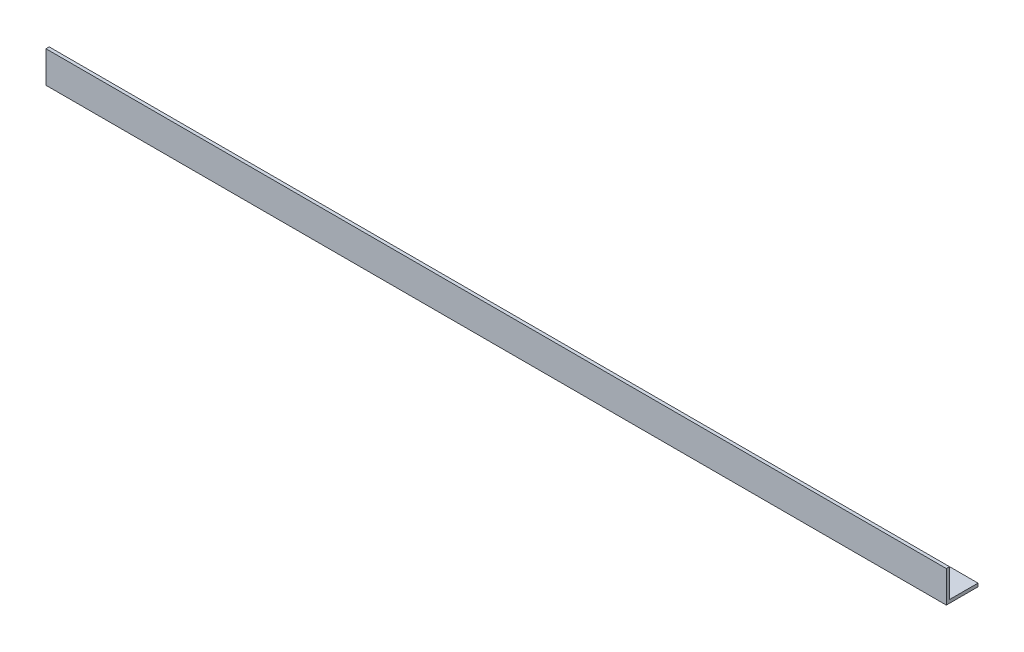
ISO-10303-21;
HEADER;
FILE_DESCRIPTION(('STEP AP214'),'2;1');
FILE_NAME('part.step','',(''),(''),'','','');
FILE_SCHEMA(('AUTOMOTIVE_DESIGN { 1 0 10303 214 1 1 1 1 }'));
ENDSEC;
DATA;
#1=APPLICATION_CONTEXT('core data for automotive mechanical design processes');
#2=APPLICATION_PROTOCOL_DEFINITION('international standard','automotive_design',2000,#1);
#3=PRODUCT_CONTEXT('',#1,'mechanical');
#4=PRODUCT('Part','Part','',(#3));
#5=PRODUCT_RELATED_PRODUCT_CATEGORY('part','',(#4));
#6=PRODUCT_DEFINITION_FORMATION('','',#4);
#7=PRODUCT_DEFINITION_CONTEXT('part definition',#1,'design');
#8=PRODUCT_DEFINITION('design','',#6,#7);
#9=PRODUCT_DEFINITION_SHAPE('','',#8);
#10=(LENGTH_UNIT() NAMED_UNIT(*) SI_UNIT(.MILLI.,.METRE.));
#11=(NAMED_UNIT(*) PLANE_ANGLE_UNIT() SI_UNIT($,.RADIAN.));
#12=(NAMED_UNIT(*) SI_UNIT($,.STERADIAN.) SOLID_ANGLE_UNIT());
#13=UNCERTAINTY_MEASURE_WITH_UNIT(LENGTH_MEASURE(1.E-05),#10,'distance_accuracy_value','');
#14=(GEOMETRIC_REPRESENTATION_CONTEXT(3) GLOBAL_UNCERTAINTY_ASSIGNED_CONTEXT((#13)) GLOBAL_UNIT_ASSIGNED_CONTEXT((#10,
#11,#12)) REPRESENTATION_CONTEXT('',''));
#15=CARTESIAN_POINT('',(0.,0.,0.));
#16=DIRECTION('',(0.,0.,1.));
#17=DIRECTION('',(1.,0.,0.));
#18=AXIS2_PLACEMENT_3D('',#15,#16,#17);
#19=CARTESIAN_POINT('',(361.,0.,-1.3));
#20=DIRECTION('',(0.,-1.,0.));
#21=DIRECTION('',(0.,0.,-1.));
#22=AXIS2_PLACEMENT_3D('',#19,#20,#21);
#23=PLANE('',#22);
#24=DIRECTION('',(0.,0.,1.));
#25=VECTOR('',#24,1.);
#26=CARTESIAN_POINT('',(0.,0.,-1.3));
#27=LINE('',#26,#25);
#28=CARTESIAN_POINT('',(0.,0.,-1.3));
#29=VERTEX_POINT('',#28);
#30=CARTESIAN_POINT('',(0.,0.,0.));
#31=VERTEX_POINT('',#30);
#32=EDGE_CURVE('E128',#29,#31,#27,.T.);
#33=ORIENTED_EDGE('',*,*,#32,.T.);
#34=DIRECTION('',(-1.,0.,0.));
#35=VECTOR('',#34,1.);
#36=CARTESIAN_POINT('',(361.,0.,0.));
#37=LINE('',#36,#35);
#38=CARTESIAN_POINT('',(361.,0.,0.));
#39=VERTEX_POINT('',#38);
#40=EDGE_CURVE('E11',#39,#31,#37,.T.);
#41=ORIENTED_EDGE('',*,*,#40,.F.);
#42=DIRECTION('',(0.,0.,1.));
#43=VECTOR('',#42,1.);
#44=CARTESIAN_POINT('',(361.,0.,-1.3));
#45=LINE('',#44,#43);
#46=CARTESIAN_POINT('',(361.,0.,-1.3));
#47=VERTEX_POINT('',#46);
#48=EDGE_CURVE('E144',#47,#39,#45,.T.);
#49=ORIENTED_EDGE('',*,*,#48,.F.);
#50=DIRECTION('',(-1.,0.,0.));
#51=VECTOR('',#50,1.);
#52=CARTESIAN_POINT('',(361.,0.,-1.3));
#53=LINE('',#52,#51);
#54=EDGE_CURVE('E124',#47,#29,#53,.T.);
#55=ORIENTED_EDGE('',*,*,#54,.T.);
#56=EDGE_LOOP('',(#33,#41,#49,#55));
#57=FACE_BOUND('',#56,.T.);
#58=ADVANCED_FACE('F39',(#57),#23,.F.);
#59=CARTESIAN_POINT('',(361.,0.,0.));
#60=DIRECTION('',(0.,0.,-1.));
#61=DIRECTION('',(0.,1.,0.));
#62=AXIS2_PLACEMENT_3D('',#59,#60,#61);
#63=PLANE('',#62);
#64=DIRECTION('',(0.,-1.,0.));
#65=VECTOR('',#64,1.);
#66=CARTESIAN_POINT('',(0.,0.,0.));
#67=LINE('',#66,#65);
#68=CARTESIAN_POINT('',(0.,-12.7,0.));
#69=VERTEX_POINT('',#68);
#70=EDGE_CURVE('E132',#31,#69,#67,.T.);
#71=ORIENTED_EDGE('',*,*,#70,.T.);
#72=DIRECTION('',(-1.,0.,0.));
#73=VECTOR('',#72,1.);
#74=CARTESIAN_POINT('',(361.,-12.7,0.));
#75=LINE('',#74,#73);
#76=CARTESIAN_POINT('',(361.,-12.7,0.));
#77=VERTEX_POINT('',#76);
#78=EDGE_CURVE('E48',#77,#69,#75,.T.);
#79=ORIENTED_EDGE('',*,*,#78,.F.);
#80=DIRECTION('',(0.,-1.,0.));
#81=VECTOR('',#80,1.);
#82=CARTESIAN_POINT('',(361.,0.,0.));
#83=LINE('',#82,#81);
#84=EDGE_CURVE('E93',#39,#77,#83,.T.);
#85=ORIENTED_EDGE('',*,*,#84,.F.);
#86=ORIENTED_EDGE('',*,*,#40,.T.);
#87=EDGE_LOOP('',(#71,#79,#85,#86));
#88=FACE_BOUND('',#87,.T.);
#89=ADVANCED_FACE('F172',(#88),#63,.F.);
#90=CARTESIAN_POINT('',(361.,-12.7,0.));
#91=DIRECTION('',(0.,1.,0.));
#92=DIRECTION('',(0.,0.,1.));
#93=AXIS2_PLACEMENT_3D('',#90,#91,#92);
#94=PLANE('',#93);
#95=DIRECTION('',(0.,0.,-1.));
#96=VECTOR('',#95,1.);
#97=CARTESIAN_POINT('',(0.,-12.7,0.));
#98=LINE('',#97,#96);
#99=CARTESIAN_POINT('',(0.,-12.7,-12.7));
#100=VERTEX_POINT('',#99);
#101=EDGE_CURVE('E135',#69,#100,#98,.T.);
#102=ORIENTED_EDGE('',*,*,#101,.T.);
#103=DIRECTION('',(-1.,0.,0.));
#104=VECTOR('',#103,1.);
#105=CARTESIAN_POINT('',(361.,-12.7,-12.7));
#106=LINE('',#105,#104);
#107=CARTESIAN_POINT('',(361.,-12.7,-12.7));
#108=VERTEX_POINT('',#107);
#109=EDGE_CURVE('E117',#108,#100,#106,.T.);
#110=ORIENTED_EDGE('',*,*,#109,.F.);
#111=DIRECTION('',(0.,0.,-1.));
#112=VECTOR('',#111,1.);
#113=CARTESIAN_POINT('',(361.,-12.7,0.));
#114=LINE('',#113,#112);
#115=EDGE_CURVE('E106',#77,#108,#114,.T.);
#116=ORIENTED_EDGE('',*,*,#115,.F.);
#117=ORIENTED_EDGE('',*,*,#78,.T.);
#118=EDGE_LOOP('',(#102,#110,#116,#117));
#119=FACE_BOUND('',#118,.T.);
#120=ADVANCED_FACE('F154',(#119),#94,.F.);
#121=CARTESIAN_POINT('',(361.,-12.7,-12.7));
#122=DIRECTION('',(0.,0.,1.));
#123=DIRECTION('',(0.,-1.,0.));
#124=AXIS2_PLACEMENT_3D('',#121,#122,#123);
#125=PLANE('',#124);
#126=DIRECTION('',(0.,1.,0.));
#127=VECTOR('',#126,1.);
#128=CARTESIAN_POINT('',(0.,-12.7,-12.7));
#129=LINE('',#128,#127);
#130=CARTESIAN_POINT('',(0.,-11.4,-12.7));
#131=VERTEX_POINT('',#130);
#132=EDGE_CURVE('E115',#100,#131,#129,.T.);
#133=ORIENTED_EDGE('',*,*,#132,.T.);
#134=DIRECTION('',(-1.,0.,0.));
#135=VECTOR('',#134,1.);
#136=CARTESIAN_POINT('',(361.,-11.4,-12.7));
#137=LINE('',#136,#135);
#138=CARTESIAN_POINT('',(361.,-11.4,-12.7));
#139=VERTEX_POINT('',#138);
#140=EDGE_CURVE('E112',#139,#131,#137,.T.);
#141=ORIENTED_EDGE('',*,*,#140,.F.);
#142=DIRECTION('',(0.,1.,0.));
#143=VECTOR('',#142,1.);
#144=CARTESIAN_POINT('',(361.,-12.7,-12.7));
#145=LINE('',#144,#143);
#146=EDGE_CURVE('E100',#108,#139,#145,.T.);
#147=ORIENTED_EDGE('',*,*,#146,.F.);
#148=ORIENTED_EDGE('',*,*,#109,.T.);
#149=EDGE_LOOP('',(#133,#141,#147,#148));
#150=FACE_BOUND('',#149,.T.);
#151=ADVANCED_FACE('F113',(#150),#125,.F.);
#152=CARTESIAN_POINT('',(361.,-11.4,-12.7));
#153=DIRECTION('',(0.,-1.,0.));
#154=DIRECTION('',(0.,0.,-1.));
#155=AXIS2_PLACEMENT_3D('',#152,#153,#154);
#156=PLANE('',#155);
#157=DIRECTION('',(0.,0.,1.));
#158=VECTOR('',#157,1.);
#159=CARTESIAN_POINT('',(0.,-11.4,-12.7));
#160=LINE('',#159,#158);
#161=CARTESIAN_POINT('',(0.,-11.4,-1.3));
#162=VERTEX_POINT('',#161);
#163=EDGE_CURVE('E79',#131,#162,#160,.T.);
#164=ORIENTED_EDGE('',*,*,#163,.T.);
#165=DIRECTION('',(-1.,0.,0.));
#166=VECTOR('',#165,1.);
#167=CARTESIAN_POINT('',(361.,-11.4,-1.3));
#168=LINE('',#167,#166);
#169=CARTESIAN_POINT('',(361.,-11.4,-1.3));
#170=VERTEX_POINT('',#169);
#171=EDGE_CURVE('E118',#170,#162,#168,.T.);
#172=ORIENTED_EDGE('',*,*,#171,.F.);
#173=DIRECTION('',(0.,0.,1.));
#174=VECTOR('',#173,1.);
#175=CARTESIAN_POINT('',(361.,-11.4,-12.7));
#176=LINE('',#175,#174);
#177=EDGE_CURVE('E104',#139,#170,#176,.T.);
#178=ORIENTED_EDGE('',*,*,#177,.F.);
#179=ORIENTED_EDGE('',*,*,#140,.T.);
#180=EDGE_LOOP('',(#164,#172,#178,#179));
#181=FACE_BOUND('',#180,.T.);
#182=ADVANCED_FACE('F120',(#181),#156,.F.);
#183=CARTESIAN_POINT('',(361.,-11.4,-1.3));
#184=DIRECTION('',(0.,0.,1.));
#185=DIRECTION('',(0.,-1.,0.));
#186=AXIS2_PLACEMENT_3D('',#183,#184,#185);
#187=PLANE('',#186);
#188=DIRECTION('',(0.,1.,0.));
#189=VECTOR('',#188,1.);
#190=CARTESIAN_POINT('',(0.,-11.4,-1.3));
#191=LINE('',#190,#189);
#192=EDGE_CURVE('E85',#162,#29,#191,.T.);
#193=ORIENTED_EDGE('',*,*,#192,.T.);
#194=ORIENTED_EDGE('',*,*,#54,.F.);
#195=DIRECTION('',(0.,1.,0.));
#196=VECTOR('',#195,1.);
#197=CARTESIAN_POINT('',(361.,-11.4,-1.3));
#198=LINE('',#197,#196);
#199=EDGE_CURVE('E56',#170,#47,#198,.T.);
#200=ORIENTED_EDGE('',*,*,#199,.F.);
#201=ORIENTED_EDGE('',*,*,#171,.T.);
#202=EDGE_LOOP('',(#193,#194,#200,#201));
#203=FACE_BOUND('',#202,.T.);
#204=ADVANCED_FACE('F161',(#203),#187,.F.);
#205=CARTESIAN_POINT('',(361.,0.,0.));
#206=DIRECTION('',(1.,0.,0.));
#207=DIRECTION('',(0.,0.,-1.));
#208=AXIS2_PLACEMENT_3D('',#205,#206,#207);
#209=PLANE('',#208);
#210=ORIENTED_EDGE('',*,*,#48,.T.);
#211=ORIENTED_EDGE('',*,*,#84,.T.);
#212=ORIENTED_EDGE('',*,*,#115,.T.);
#213=ORIENTED_EDGE('',*,*,#146,.T.);
#214=ORIENTED_EDGE('',*,*,#177,.T.);
#215=ORIENTED_EDGE('',*,*,#199,.T.);
#216=EDGE_LOOP('',(#210,#211,#212,#213,#214,#215));
#217=FACE_BOUND('',#216,.T.);
#218=ADVANCED_FACE('F102',(#217),#209,.T.);
#219=CARTESIAN_POINT('',(0.,0.,0.));
#220=DIRECTION('',(1.,0.,0.));
#221=DIRECTION('',(0.,0.,-1.));
#222=AXIS2_PLACEMENT_3D('',#219,#220,#221);
#223=PLANE('',#222);
#224=ORIENTED_EDGE('',*,*,#32,.F.);
#225=ORIENTED_EDGE('',*,*,#192,.F.);
#226=ORIENTED_EDGE('',*,*,#163,.F.);
#227=ORIENTED_EDGE('',*,*,#132,.F.);
#228=ORIENTED_EDGE('',*,*,#101,.F.);
#229=ORIENTED_EDGE('',*,*,#70,.F.);
#230=EDGE_LOOP('',(#224,#225,#226,#227,#228,#229));
#231=FACE_BOUND('',#230,.T.);
#232=ADVANCED_FACE('F157',(#231),#223,.F.);
#233=CLOSED_SHELL('',(#58,#89,#120,#151,#182,#204,#218,#232));
#234=MANIFOLD_SOLID_BREP('B2',#233);
#235=ADVANCED_BREP_SHAPE_REPRESENTATION('',(#18,#234),#14);
#236=SHAPE_DEFINITION_REPRESENTATION(#9,#235);
ENDSEC;
END-ISO-10303-21;
